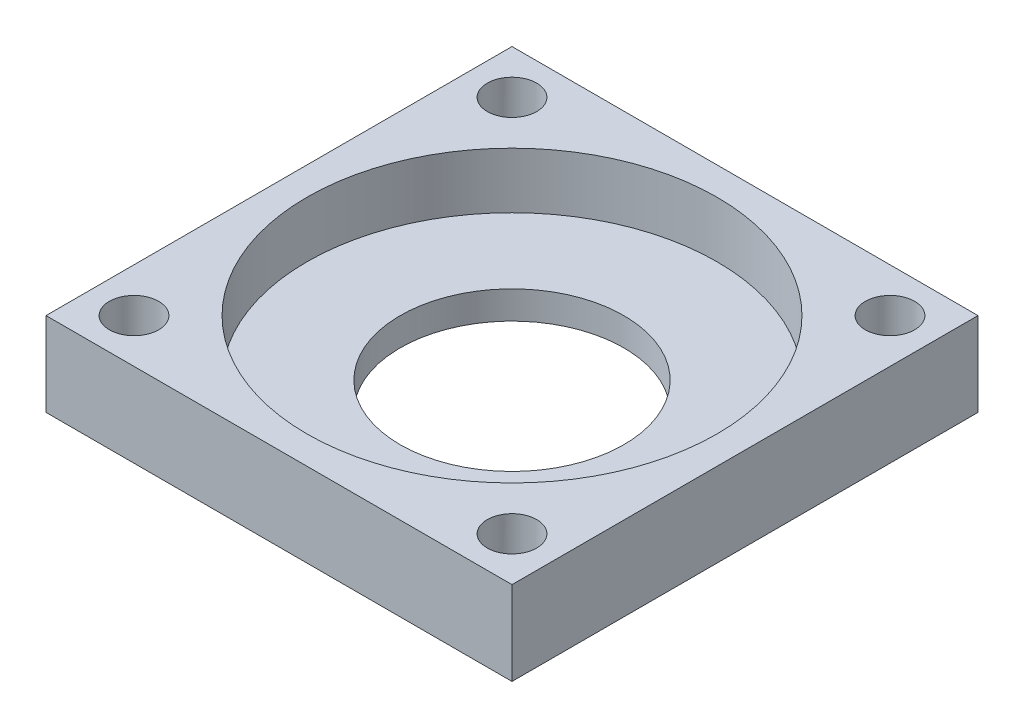
ISO-10303-21;
HEADER;
FILE_DESCRIPTION(('STEP AP214'),'2;1');
FILE_NAME('part.step','',(''),(''),'','','');
FILE_SCHEMA(('AUTOMOTIVE_DESIGN { 1 0 10303 214 1 1 1 1 }'));
ENDSEC;
DATA;
#1=APPLICATION_CONTEXT('core data for automotive mechanical design processes');
#2=APPLICATION_PROTOCOL_DEFINITION('international standard','automotive_design',2000,#1);
#3=PRODUCT_CONTEXT('',#1,'mechanical');
#4=PRODUCT('Part','Part','',(#3));
#5=PRODUCT_RELATED_PRODUCT_CATEGORY('part','',(#4));
#6=PRODUCT_DEFINITION_FORMATION('','',#4);
#7=PRODUCT_DEFINITION_CONTEXT('part definition',#1,'design');
#8=PRODUCT_DEFINITION('design','',#6,#7);
#9=PRODUCT_DEFINITION_SHAPE('','',#8);
#10=(LENGTH_UNIT() NAMED_UNIT(*) SI_UNIT(.MILLI.,.METRE.));
#11=(NAMED_UNIT(*) PLANE_ANGLE_UNIT() SI_UNIT($,.RADIAN.));
#12=(NAMED_UNIT(*) SI_UNIT($,.STERADIAN.) SOLID_ANGLE_UNIT());
#13=UNCERTAINTY_MEASURE_WITH_UNIT(LENGTH_MEASURE(1.E-05),#10,'distance_accuracy_value','');
#14=(GEOMETRIC_REPRESENTATION_CONTEXT(3) GLOBAL_UNCERTAINTY_ASSIGNED_CONTEXT((#13)) GLOBAL_UNIT_ASSIGNED_CONTEXT((#10,
#11,#12)) REPRESENTATION_CONTEXT('',''));
#15=CARTESIAN_POINT('',(0.,0.,0.));
#16=DIRECTION('',(0.,0.,1.));
#17=DIRECTION('',(1.,0.,0.));
#18=AXIS2_PLACEMENT_3D('',#15,#16,#17);
#19=CARTESIAN_POINT('',(0.,3.,0.));
#20=DIRECTION('',(0.,-1.,0.));
#21=DIRECTION('',(0.,0.,-1.));
#22=AXIS2_PLACEMENT_3D('',#19,#20,#21);
#23=PLANE('',#22);
#24=CARTESIAN_POINT('',(0.,3.,0.));
#25=DIRECTION('',(0.,1.,0.));
#26=DIRECTION('',(0.,0.,1.));
#27=AXIS2_PLACEMENT_3D('',#24,#25,#26);
#28=CIRCLE('',#27,12.);
#29=CARTESIAN_POINT('',(0.,3.,12.));
#30=VERTEX_POINT('',#29);
#31=EDGE_CURVE('E119',#30,#30,#28,.T.);
#32=ORIENTED_EDGE('',*,*,#31,.F.);
#33=EDGE_LOOP('',(#32));
#34=FACE_BOUND('',#33,.T.);
#35=CARTESIAN_POINT('',(0.,3.,0.));
#36=DIRECTION('',(0.,1.,0.));
#37=DIRECTION('',(0.,0.,1.));
#38=AXIS2_PLACEMENT_3D('',#35,#36,#37);
#39=CIRCLE('',#38,22.);
#40=CARTESIAN_POINT('',(0.,3.,22.));
#41=VERTEX_POINT('',#40);
#42=EDGE_CURVE('E110',#41,#41,#39,.T.);
#43=ORIENTED_EDGE('',*,*,#42,.T.);
#44=EDGE_LOOP('',(#43));
#45=FACE_BOUND('',#44,.T.);
#46=ADVANCED_FACE('F42',(#34,#45),#23,.F.);
#47=CARTESIAN_POINT('',(0.,0.,0.));
#48=DIRECTION('',(0.,-1.,0.));
#49=DIRECTION('',(0.,0.,-1.));
#50=AXIS2_PLACEMENT_3D('',#47,#48,#49);
#51=PLANE('',#50);
#52=CARTESIAN_POINT('',(20.278174593052,0.,-20.278174593052));
#53=DIRECTION('',(0.,-1.,0.));
#54=DIRECTION('',(0.,0.,-1.));
#55=AXIS2_PLACEMENT_3D('',#52,#53,#54);
#56=CIRCLE('',#55,2.65);
#57=CARTESIAN_POINT('',(20.278174593052,0.,-22.928174593052));
#58=VERTEX_POINT('',#57);
#59=EDGE_CURVE('E310',#58,#58,#56,.T.);
#60=ORIENTED_EDGE('',*,*,#59,.F.);
#61=EDGE_LOOP('',(#60));
#62=FACE_BOUND('',#61,.T.);
#63=CARTESIAN_POINT('',(20.278174593052,0.,20.278174593052));
#64=DIRECTION('',(0.,-1.,0.));
#65=DIRECTION('',(0.,0.,-1.));
#66=AXIS2_PLACEMENT_3D('',#63,#64,#65);
#67=CIRCLE('',#66,2.65);
#68=CARTESIAN_POINT('',(20.278174593052,0.,17.628174593052));
#69=VERTEX_POINT('',#68);
#70=EDGE_CURVE('E313',#69,#69,#67,.T.);
#71=ORIENTED_EDGE('',*,*,#70,.F.);
#72=EDGE_LOOP('',(#71));
#73=FACE_BOUND('',#72,.T.);
#74=CARTESIAN_POINT('',(-20.278174593052,0.,20.278174593052));
#75=DIRECTION('',(0.,-1.,0.));
#76=DIRECTION('',(0.,0.,-1.));
#77=AXIS2_PLACEMENT_3D('',#74,#75,#76);
#78=CIRCLE('',#77,2.65);
#79=CARTESIAN_POINT('',(-20.278174593052,0.,17.628174593052));
#80=VERTEX_POINT('',#79);
#81=EDGE_CURVE('E318',#80,#80,#78,.T.);
#82=ORIENTED_EDGE('',*,*,#81,.F.);
#83=EDGE_LOOP('',(#82));
#84=FACE_BOUND('',#83,.T.);
#85=CARTESIAN_POINT('',(-20.278174593052,0.,-20.278174593052));
#86=DIRECTION('',(0.,-1.,0.));
#87=DIRECTION('',(0.,0.,-1.));
#88=AXIS2_PLACEMENT_3D('',#85,#86,#87);
#89=CIRCLE('',#88,2.65);
#90=CARTESIAN_POINT('',(-20.278174593052,0.,-22.928174593052));
#91=VERTEX_POINT('',#90);
#92=EDGE_CURVE('E324',#91,#91,#89,.T.);
#93=ORIENTED_EDGE('',*,*,#92,.F.);
#94=EDGE_LOOP('',(#93));
#95=FACE_BOUND('',#94,.T.);
#96=DIRECTION('',(0.,0.,-1.));
#97=VECTOR('',#96,1.);
#98=CARTESIAN_POINT('',(25.,0.,25.));
#99=LINE('',#98,#97);
#100=CARTESIAN_POINT('',(25.,0.,25.));
#101=VERTEX_POINT('',#100);
#102=CARTESIAN_POINT('',(25.,0.,-25.));
#103=VERTEX_POINT('',#102);
#104=EDGE_CURVE('E89',#101,#103,#99,.T.);
#105=ORIENTED_EDGE('',*,*,#104,.F.);
#106=DIRECTION('',(1.,0.,0.));
#107=VECTOR('',#106,1.);
#108=CARTESIAN_POINT('',(-25.,0.,25.));
#109=LINE('',#108,#107);
#110=CARTESIAN_POINT('',(-25.,0.,25.));
#111=VERTEX_POINT('',#110);
#112=EDGE_CURVE('E58',#111,#101,#109,.T.);
#113=ORIENTED_EDGE('',*,*,#112,.F.);
#114=DIRECTION('',(0.,0.,1.));
#115=VECTOR('',#114,1.);
#116=CARTESIAN_POINT('',(-25.,0.,25.));
#117=LINE('',#116,#115);
#118=CARTESIAN_POINT('',(-25.,0.,-25.));
#119=VERTEX_POINT('',#118);
#120=EDGE_CURVE('E66',#119,#111,#117,.T.);
#121=ORIENTED_EDGE('',*,*,#120,.F.);
#122=DIRECTION('',(-1.,0.,0.));
#123=VECTOR('',#122,1.);
#124=CARTESIAN_POINT('',(-25.,0.,-25.));
#125=LINE('',#124,#123);
#126=EDGE_CURVE('E128',#103,#119,#125,.T.);
#127=ORIENTED_EDGE('',*,*,#126,.F.);
#128=EDGE_LOOP('',(#105,#113,#121,#127));
#129=FACE_BOUND('',#128,.T.);
#130=CARTESIAN_POINT('',(0.,0.,0.));
#131=DIRECTION('',(0.,1.,0.));
#132=DIRECTION('',(0.,0.,1.));
#133=AXIS2_PLACEMENT_3D('',#130,#131,#132);
#134=CIRCLE('',#133,12.);
#135=CARTESIAN_POINT('',(0.,0.,12.));
#136=VERTEX_POINT('',#135);
#137=EDGE_CURVE('E118',#136,#136,#134,.T.);
#138=ORIENTED_EDGE('',*,*,#137,.T.);
#139=EDGE_LOOP('',(#138));
#140=FACE_BOUND('',#139,.T.);
#141=ADVANCED_FACE('F143',(#62,#73,#84,#95,#129,#140),#51,.T.);
#142=CARTESIAN_POINT('',(25.,3.,25.));
#143=DIRECTION('',(-1.,0.,0.));
#144=DIRECTION('',(0.,0.,1.));
#145=AXIS2_PLACEMENT_3D('',#142,#143,#144);
#146=PLANE('',#145);
#147=ORIENTED_EDGE('',*,*,#104,.T.);
#148=DIRECTION('',(0.,-1.,0.));
#149=VECTOR('',#148,1.);
#150=CARTESIAN_POINT('',(25.,3.,-25.));
#151=LINE('',#150,#149);
#152=CARTESIAN_POINT('',(25.,9.,-25.));
#153=VERTEX_POINT('',#152);
#154=EDGE_CURVE('E11',#153,#103,#151,.T.);
#155=ORIENTED_EDGE('',*,*,#154,.F.);
#156=DIRECTION('',(0.,0.,-1.));
#157=VECTOR('',#156,1.);
#158=CARTESIAN_POINT('',(25.,9.,25.));
#159=LINE('',#158,#157);
#160=CARTESIAN_POINT('',(25.,9.,25.));
#161=VERTEX_POINT('',#160);
#162=EDGE_CURVE('E87',#161,#153,#159,.T.);
#163=ORIENTED_EDGE('',*,*,#162,.F.);
#164=DIRECTION('',(0.,-1.,0.));
#165=VECTOR('',#164,1.);
#166=CARTESIAN_POINT('',(25.,3.,25.));
#167=LINE('',#166,#165);
#168=EDGE_CURVE('E135',#161,#101,#167,.T.);
#169=ORIENTED_EDGE('',*,*,#168,.T.);
#170=EDGE_LOOP('',(#147,#155,#163,#169));
#171=FACE_BOUND('',#170,.T.);
#172=ADVANCED_FACE('F44',(#171),#146,.F.);
#173=CARTESIAN_POINT('',(-25.,3.,-25.));
#174=DIRECTION('',(0.,0.,1.));
#175=DIRECTION('',(1.,0.,0.));
#176=AXIS2_PLACEMENT_3D('',#173,#174,#175);
#177=PLANE('',#176);
#178=ORIENTED_EDGE('',*,*,#126,.T.);
#179=DIRECTION('',(0.,-1.,0.));
#180=VECTOR('',#179,1.);
#181=CARTESIAN_POINT('',(-25.,3.,-25.));
#182=LINE('',#181,#180);
#183=CARTESIAN_POINT('',(-25.,9.,-25.));
#184=VERTEX_POINT('',#183);
#185=EDGE_CURVE('E51',#184,#119,#182,.T.);
#186=ORIENTED_EDGE('',*,*,#185,.F.);
#187=DIRECTION('',(-1.,0.,0.));
#188=VECTOR('',#187,1.);
#189=CARTESIAN_POINT('',(-25.,9.,-25.));
#190=LINE('',#189,#188);
#191=EDGE_CURVE('E92',#153,#184,#190,.T.);
#192=ORIENTED_EDGE('',*,*,#191,.F.);
#193=ORIENTED_EDGE('',*,*,#154,.T.);
#194=EDGE_LOOP('',(#178,#186,#192,#193));
#195=FACE_BOUND('',#194,.T.);
#196=ADVANCED_FACE('F93',(#195),#177,.F.);
#197=CARTESIAN_POINT('',(-25.,3.,25.));
#198=DIRECTION('',(1.,0.,0.));
#199=DIRECTION('',(0.,0.,-1.));
#200=AXIS2_PLACEMENT_3D('',#197,#198,#199);
#201=PLANE('',#200);
#202=ORIENTED_EDGE('',*,*,#120,.T.);
#203=DIRECTION('',(0.,-1.,0.));
#204=VECTOR('',#203,1.);
#205=CARTESIAN_POINT('',(-25.,3.,25.));
#206=LINE('',#205,#204);
#207=CARTESIAN_POINT('',(-25.,9.,25.));
#208=VERTEX_POINT('',#207);
#209=EDGE_CURVE('E138',#208,#111,#206,.T.);
#210=ORIENTED_EDGE('',*,*,#209,.F.);
#211=DIRECTION('',(0.,0.,1.));
#212=VECTOR('',#211,1.);
#213=CARTESIAN_POINT('',(-25.,9.,25.));
#214=LINE('',#213,#212);
#215=EDGE_CURVE('E98',#184,#208,#214,.T.);
#216=ORIENTED_EDGE('',*,*,#215,.F.);
#217=ORIENTED_EDGE('',*,*,#185,.T.);
#218=EDGE_LOOP('',(#202,#210,#216,#217));
#219=FACE_BOUND('',#218,.T.);
#220=ADVANCED_FACE('F141',(#219),#201,.F.);
#221=CARTESIAN_POINT('',(-25.,3.,25.));
#222=DIRECTION('',(0.,0.,-1.));
#223=DIRECTION('',(-1.,0.,0.));
#224=AXIS2_PLACEMENT_3D('',#221,#222,#223);
#225=PLANE('',#224);
#226=ORIENTED_EDGE('',*,*,#112,.T.);
#227=ORIENTED_EDGE('',*,*,#168,.F.);
#228=DIRECTION('',(1.,0.,0.));
#229=VECTOR('',#228,1.);
#230=CARTESIAN_POINT('',(-25.,9.,25.));
#231=LINE('',#230,#229);
#232=EDGE_CURVE('E104',#208,#161,#231,.T.);
#233=ORIENTED_EDGE('',*,*,#232,.F.);
#234=ORIENTED_EDGE('',*,*,#209,.T.);
#235=EDGE_LOOP('',(#226,#227,#233,#234));
#236=FACE_BOUND('',#235,.T.);
#237=ADVANCED_FACE('F152',(#236),#225,.F.);
#238=CARTESIAN_POINT('',(0.,3.,0.));
#239=DIRECTION('',(0.,-1.,0.));
#240=DIRECTION('',(0.,0.,-1.));
#241=AXIS2_PLACEMENT_3D('',#238,#239,#240);
#242=CYLINDRICAL_SURFACE('',#241,12.);
#243=ORIENTED_EDGE('',*,*,#31,.T.);
#244=EDGE_LOOP('',(#243));
#245=FACE_BOUND('',#244,.T.);
#246=ORIENTED_EDGE('',*,*,#137,.F.);
#247=EDGE_LOOP('',(#246));
#248=FACE_BOUND('',#247,.T.);
#249=ADVANCED_FACE('F150',(#245,#248),#242,.F.);
#250=CARTESIAN_POINT('',(0.,9.,0.));
#251=DIRECTION('',(0.,-1.,0.));
#252=DIRECTION('',(0.,0.,-1.));
#253=AXIS2_PLACEMENT_3D('',#250,#251,#252);
#254=PLANE('',#253);
#255=CARTESIAN_POINT('',(20.278174593052,9.,-20.278174593052));
#256=DIRECTION('',(0.,1.,0.));
#257=DIRECTION('',(0.,0.,-1.));
#258=AXIS2_PLACEMENT_3D('',#255,#256,#257);
#259=CIRCLE('',#258,2.65);
#260=CARTESIAN_POINT('',(20.278174593052,9.,-22.928174593052));
#261=VERTEX_POINT('',#260);
#262=EDGE_CURVE('E333',#261,#261,#259,.T.);
#263=ORIENTED_EDGE('',*,*,#262,.F.);
#264=EDGE_LOOP('',(#263));
#265=FACE_BOUND('',#264,.T.);
#266=CARTESIAN_POINT('',(20.278174593052,9.,20.278174593052));
#267=DIRECTION('',(0.,1.,0.));
#268=DIRECTION('',(0.,0.,1.));
#269=AXIS2_PLACEMENT_3D('',#266,#267,#268);
#270=CIRCLE('',#269,2.65);
#271=CARTESIAN_POINT('',(20.278174593052,9.,22.928174593052));
#272=VERTEX_POINT('',#271);
#273=EDGE_CURVE('E337',#272,#272,#270,.T.);
#274=ORIENTED_EDGE('',*,*,#273,.F.);
#275=EDGE_LOOP('',(#274));
#276=FACE_BOUND('',#275,.T.);
#277=CARTESIAN_POINT('',(-20.278174593052,9.,20.278174593052));
#278=DIRECTION('',(0.,1.,0.));
#279=DIRECTION('',(0.,0.,-1.));
#280=AXIS2_PLACEMENT_3D('',#277,#278,#279);
#281=CIRCLE('',#280,2.65);
#282=CARTESIAN_POINT('',(-20.278174593052,9.,17.628174593052));
#283=VERTEX_POINT('',#282);
#284=EDGE_CURVE('E332',#283,#283,#281,.T.);
#285=ORIENTED_EDGE('',*,*,#284,.F.);
#286=EDGE_LOOP('',(#285));
#287=FACE_BOUND('',#286,.T.);
#288=CARTESIAN_POINT('',(-20.278174593052,9.,-20.278174593052));
#289=DIRECTION('',(0.,1.,0.));
#290=DIRECTION('',(0.,0.,1.));
#291=AXIS2_PLACEMENT_3D('',#288,#289,#290);
#292=CIRCLE('',#291,2.65);
#293=CARTESIAN_POINT('',(-20.278174593052,9.,-17.628174593052));
#294=VERTEX_POINT('',#293);
#295=EDGE_CURVE('E328',#294,#294,#292,.T.);
#296=ORIENTED_EDGE('',*,*,#295,.F.);
#297=EDGE_LOOP('',(#296));
#298=FACE_BOUND('',#297,.T.);
#299=ORIENTED_EDGE('',*,*,#162,.T.);
#300=ORIENTED_EDGE('',*,*,#191,.T.);
#301=ORIENTED_EDGE('',*,*,#215,.T.);
#302=ORIENTED_EDGE('',*,*,#232,.T.);
#303=EDGE_LOOP('',(#299,#300,#301,#302));
#304=FACE_BOUND('',#303,.T.);
#305=CARTESIAN_POINT('',(0.,9.,0.));
#306=DIRECTION('',(0.,1.,0.));
#307=DIRECTION('',(0.,0.,1.));
#308=AXIS2_PLACEMENT_3D('',#305,#306,#307);
#309=CIRCLE('',#308,22.);
#310=CARTESIAN_POINT('',(0.,9.,22.));
#311=VERTEX_POINT('',#310);
#312=EDGE_CURVE('E106',#311,#311,#309,.T.);
#313=ORIENTED_EDGE('',*,*,#312,.F.);
#314=EDGE_LOOP('',(#313));
#315=FACE_BOUND('',#314,.T.);
#316=ADVANCED_FACE('F101',(#265,#276,#287,#298,#304,#315),#254,.F.);
#317=CARTESIAN_POINT('',(0.,9.,0.));
#318=DIRECTION('',(0.,-1.,0.));
#319=DIRECTION('',(0.,0.,-1.));
#320=AXIS2_PLACEMENT_3D('',#317,#318,#319);
#321=CYLINDRICAL_SURFACE('',#320,22.);
#322=ORIENTED_EDGE('',*,*,#312,.T.);
#323=EDGE_LOOP('',(#322));
#324=FACE_BOUND('',#323,.T.);
#325=ORIENTED_EDGE('',*,*,#42,.F.);
#326=EDGE_LOOP('',(#325));
#327=FACE_BOUND('',#326,.T.);
#328=ADVANCED_FACE('F159',(#324,#327),#321,.F.);
#329=CARTESIAN_POINT('',(-20.278174593052,-21.,-20.278174593052));
#330=DIRECTION('',(0.,1.,0.));
#331=DIRECTION('',(0.,0.,1.));
#332=AXIS2_PLACEMENT_3D('',#329,#330,#331);
#333=CYLINDRICAL_SURFACE('',#332,2.65);
#334=ORIENTED_EDGE('',*,*,#92,.T.);
#335=EDGE_LOOP('',(#334));
#336=FACE_BOUND('',#335,.T.);
#337=ORIENTED_EDGE('',*,*,#295,.T.);
#338=EDGE_LOOP('',(#337));
#339=FACE_BOUND('',#338,.T.);
#340=ADVANCED_FACE('F202',(#336,#339),#333,.F.);
#341=CARTESIAN_POINT('',(-20.278174593052,-21.,20.278174593052));
#342=DIRECTION('',(0.,1.,0.));
#343=DIRECTION('',(0.,0.,1.));
#344=AXIS2_PLACEMENT_3D('',#341,#342,#343);
#345=CYLINDRICAL_SURFACE('',#344,2.65);
#346=ORIENTED_EDGE('',*,*,#81,.T.);
#347=EDGE_LOOP('',(#346));
#348=FACE_BOUND('',#347,.T.);
#349=ORIENTED_EDGE('',*,*,#284,.T.);
#350=EDGE_LOOP('',(#349));
#351=FACE_BOUND('',#350,.T.);
#352=ADVANCED_FACE('F207',(#348,#351),#345,.F.);
#353=CARTESIAN_POINT('',(20.278174593052,-21.,20.278174593052));
#354=DIRECTION('',(0.,1.,0.));
#355=DIRECTION('',(0.,0.,1.));
#356=AXIS2_PLACEMENT_3D('',#353,#354,#355);
#357=CYLINDRICAL_SURFACE('',#356,2.65);
#358=ORIENTED_EDGE('',*,*,#70,.T.);
#359=EDGE_LOOP('',(#358));
#360=FACE_BOUND('',#359,.T.);
#361=ORIENTED_EDGE('',*,*,#273,.T.);
#362=EDGE_LOOP('',(#361));
#363=FACE_BOUND('',#362,.T.);
#364=ADVANCED_FACE('F218',(#360,#363),#357,.F.);
#365=CARTESIAN_POINT('',(20.278174593052,-21.,-20.278174593052));
#366=DIRECTION('',(0.,1.,0.));
#367=DIRECTION('',(0.,0.,1.));
#368=AXIS2_PLACEMENT_3D('',#365,#366,#367);
#369=CYLINDRICAL_SURFACE('',#368,2.65);
#370=ORIENTED_EDGE('',*,*,#59,.T.);
#371=EDGE_LOOP('',(#370));
#372=FACE_BOUND('',#371,.T.);
#373=ORIENTED_EDGE('',*,*,#262,.T.);
#374=EDGE_LOOP('',(#373));
#375=FACE_BOUND('',#374,.T.);
#376=ADVANCED_FACE('F229',(#372,#375),#369,.F.);
#377=CLOSED_SHELL('',(#46,#141,#172,#196,#220,#237,#249,#316,#328,#340,#352,#364,#376));
#378=MANIFOLD_SOLID_BREP('B2',#377);
#379=ADVANCED_BREP_SHAPE_REPRESENTATION('',(#18,#378),#14);
#380=SHAPE_DEFINITION_REPRESENTATION(#9,#379);
ENDSEC;
END-ISO-10303-21;
